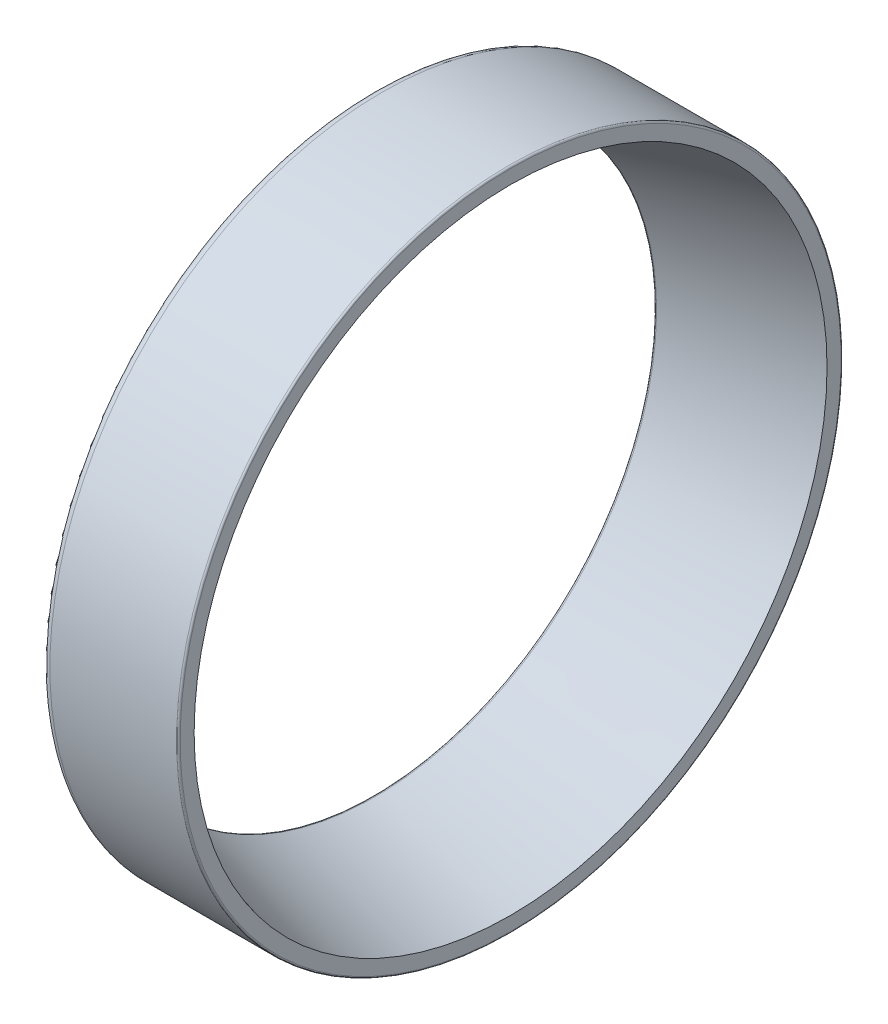
ISO-10303-21;
HEADER;
FILE_DESCRIPTION(('STEP AP214'),'2;1');
FILE_NAME('part.step','',(''),(''),'','','');
FILE_SCHEMA(('AUTOMOTIVE_DESIGN { 1 0 10303 214 1 1 1 1 }'));
ENDSEC;
DATA;
#1=APPLICATION_CONTEXT('core data for automotive mechanical design processes');
#2=APPLICATION_PROTOCOL_DEFINITION('international standard','automotive_design',2000,#1);
#3=PRODUCT_CONTEXT('',#1,'mechanical');
#4=PRODUCT('Part','Part','',(#3));
#5=PRODUCT_RELATED_PRODUCT_CATEGORY('part','',(#4));
#6=PRODUCT_DEFINITION_FORMATION('','',#4);
#7=PRODUCT_DEFINITION_CONTEXT('part definition',#1,'design');
#8=PRODUCT_DEFINITION('design','',#6,#7);
#9=PRODUCT_DEFINITION_SHAPE('','',#8);
#10=(LENGTH_UNIT() NAMED_UNIT(*) SI_UNIT(.MILLI.,.METRE.));
#11=(NAMED_UNIT(*) PLANE_ANGLE_UNIT() SI_UNIT($,.RADIAN.));
#12=(NAMED_UNIT(*) SI_UNIT($,.STERADIAN.) SOLID_ANGLE_UNIT());
#13=UNCERTAINTY_MEASURE_WITH_UNIT(LENGTH_MEASURE(1.E-05),#10,'distance_accuracy_value','');
#14=(GEOMETRIC_REPRESENTATION_CONTEXT(3) GLOBAL_UNCERTAINTY_ASSIGNED_CONTEXT((#13)) GLOBAL_UNIT_ASSIGNED_CONTEXT((#10,
#11,#12)) REPRESENTATION_CONTEXT('',''));
#15=CARTESIAN_POINT('',(0.,0.,0.));
#16=DIRECTION('',(0.,0.,1.));
#17=DIRECTION('',(1.,0.,0.));
#18=AXIS2_PLACEMENT_3D('',#15,#16,#17);
#19=CARTESIAN_POINT('',(0.2,0.,0.));
#20=DIRECTION('',(1.,0.,0.));
#21=DIRECTION('',(0.,0.,-1.));
#22=AXIS2_PLACEMENT_3D('',#19,#20,#21);
#23=TOROIDAL_SURFACE('',#22,31.9187738960017,0.2);
#24=CARTESIAN_POINT('',(0.250640159258825,0.,0.));
#25=DIRECTION('',(1.,0.,0.));
#26=DIRECTION('',(0.,1.,0.));
#27=AXIS2_PLACEMENT_3D('',#24,#25,#26);
#28=CIRCLE('',#27,31.7252911467183);
#29=CARTESIAN_POINT('',(0.250640159258825,31.7252911467183,0.));
#30=VERTEX_POINT('',#29);
#31=EDGE_CURVE('E11',#30,#30,#28,.T.);
#32=ORIENTED_EDGE('',*,*,#31,.T.);
#33=EDGE_LOOP('',(#32));
#34=FACE_BOUND('',#33,.T.);
#35=CARTESIAN_POINT('',(0.,0.,0.));
#36=DIRECTION('',(1.,0.,0.));
#37=DIRECTION('',(0.,1.,0.));
#38=AXIS2_PLACEMENT_3D('',#35,#36,#37);
#39=CIRCLE('',#38,31.9187738960017);
#40=CARTESIAN_POINT('',(0.,31.9187738960017,0.));
#41=VERTEX_POINT('',#40);
#42=EDGE_CURVE('E38',#41,#41,#39,.T.);
#43=ORIENTED_EDGE('',*,*,#42,.F.);
#44=EDGE_LOOP('',(#43));
#45=FACE_BOUND('',#44,.T.);
#46=ADVANCED_FACE('F16',(#34,#45),#23,.T.);
#47=CARTESIAN_POINT('',(7.87532007962941,0.,0.));
#48=DIRECTION('',(1.,0.,0.));
#49=DIRECTION('',(0.,1.,0.));
#50=AXIS2_PLACEMENT_3D('',#47,#48,#49);
#51=CONICAL_SURFACE('',#50,33.7208954416505,0.255987441390009);
#52=CARTESIAN_POINT('',(15.5,0.,0.));
#53=DIRECTION('',(1.,0.,0.));
#54=DIRECTION('',(0.,1.,0.));
#55=AXIS2_PLACEMENT_3D('',#52,#53,#54);
#56=CIRCLE('',#55,35.7164997365827);
#57=CARTESIAN_POINT('',(15.5,35.7164997365827,0.));
#58=VERTEX_POINT('',#57);
#59=EDGE_CURVE('E24',#58,#58,#56,.T.);
#60=ORIENTED_EDGE('',*,*,#59,.T.);
#61=EDGE_LOOP('',(#60));
#62=FACE_BOUND('',#61,.T.);
#63=ORIENTED_EDGE('',*,*,#31,.F.);
#64=EDGE_LOOP('',(#63));
#65=FACE_BOUND('',#64,.T.);
#66=ADVANCED_FACE('F81',(#62,#65),#51,.F.);
#67=CARTESIAN_POINT('',(15.5,36.5082498682914,0.));
#68=DIRECTION('',(1.,0.,0.));
#69=DIRECTION('',(0.,1.,0.));
#70=AXIS2_PLACEMENT_3D('',#67,#68,#69);
#71=PLANE('',#70);
#72=CARTESIAN_POINT('',(15.5,0.,0.));
#73=DIRECTION('',(1.,0.,0.));
#74=DIRECTION('',(0.,1.,0.));
#75=AXIS2_PLACEMENT_3D('',#72,#73,#74);
#76=CIRCLE('',#75,37.3);
#77=CARTESIAN_POINT('',(15.5,37.3,0.));
#78=VERTEX_POINT('',#77);
#79=EDGE_CURVE('E54',#78,#78,#76,.T.);
#80=ORIENTED_EDGE('',*,*,#79,.T.);
#81=EDGE_LOOP('',(#80));
#82=FACE_BOUND('',#81,.T.);
#83=ORIENTED_EDGE('',*,*,#59,.F.);
#84=EDGE_LOOP('',(#83));
#85=FACE_BOUND('',#84,.T.);
#86=ADVANCED_FACE('F55',(#82,#85),#71,.T.);
#87=CARTESIAN_POINT('',(15.3,0.,0.));
#88=DIRECTION('',(1.,0.,0.));
#89=DIRECTION('',(0.,0.,-1.));
#90=AXIS2_PLACEMENT_3D('',#87,#88,#89);
#91=TOROIDAL_SURFACE('',#90,37.3,0.2);
#92=CARTESIAN_POINT('',(15.3,0.,0.));
#93=DIRECTION('',(1.,0.,0.));
#94=DIRECTION('',(0.,1.,0.));
#95=AXIS2_PLACEMENT_3D('',#92,#93,#94);
#96=CIRCLE('',#95,37.5);
#97=CARTESIAN_POINT('',(15.3,37.5,0.));
#98=VERTEX_POINT('',#97);
#99=EDGE_CURVE('E50',#98,#98,#96,.T.);
#100=ORIENTED_EDGE('',*,*,#99,.T.);
#101=EDGE_LOOP('',(#100));
#102=FACE_BOUND('',#101,.T.);
#103=ORIENTED_EDGE('',*,*,#79,.F.);
#104=EDGE_LOOP('',(#103));
#105=FACE_BOUND('',#104,.T.);
#106=ADVANCED_FACE('F78',(#102,#105),#91,.T.);
#107=CARTESIAN_POINT('',(8.15,0.,0.));
#108=DIRECTION('',(-1.,0.,0.));
#109=DIRECTION('',(0.,1.,0.));
#110=AXIS2_PLACEMENT_3D('',#107,#108,#109);
#111=CYLINDRICAL_SURFACE('',#110,37.5);
#112=CARTESIAN_POINT('',(1.,0.,0.));
#113=DIRECTION('',(1.,0.,0.));
#114=DIRECTION('',(0.,1.,0.));
#115=AXIS2_PLACEMENT_3D('',#112,#113,#114);
#116=CIRCLE('',#115,37.5);
#117=CARTESIAN_POINT('',(1.,37.5,0.));
#118=VERTEX_POINT('',#117);
#119=EDGE_CURVE('E59',#118,#118,#116,.T.);
#120=ORIENTED_EDGE('',*,*,#119,.T.);
#121=EDGE_LOOP('',(#120));
#122=FACE_BOUND('',#121,.T.);
#123=ORIENTED_EDGE('',*,*,#99,.F.);
#124=EDGE_LOOP('',(#123));
#125=FACE_BOUND('',#124,.T.);
#126=ADVANCED_FACE('F66',(#122,#125),#111,.T.);
#127=CARTESIAN_POINT('',(1.,0.,0.));
#128=DIRECTION('',(1.,0.,0.));
#129=DIRECTION('',(0.,0.,-1.));
#130=AXIS2_PLACEMENT_3D('',#127,#128,#129);
#131=TOROIDAL_SURFACE('',#130,36.5,1.);
#132=CARTESIAN_POINT('',(0.,0.,0.));
#133=DIRECTION('',(1.,0.,0.));
#134=DIRECTION('',(0.,1.,0.));
#135=AXIS2_PLACEMENT_3D('',#132,#133,#134);
#136=CIRCLE('',#135,36.5);
#137=CARTESIAN_POINT('',(0.,36.5,0.));
#138=VERTEX_POINT('',#137);
#139=EDGE_CURVE('E46',#138,#138,#136,.T.);
#140=ORIENTED_EDGE('',*,*,#139,.T.);
#141=EDGE_LOOP('',(#140));
#142=FACE_BOUND('',#141,.T.);
#143=ORIENTED_EDGE('',*,*,#119,.F.);
#144=EDGE_LOOP('',(#143));
#145=FACE_BOUND('',#144,.T.);
#146=ADVANCED_FACE('F69',(#142,#145),#131,.T.);
#147=CARTESIAN_POINT('',(0.,34.2093869480009,0.));
#148=DIRECTION('',(-1.,0.,0.));
#149=DIRECTION('',(0.,-1.,0.));
#150=AXIS2_PLACEMENT_3D('',#147,#148,#149);
#151=PLANE('',#150);
#152=ORIENTED_EDGE('',*,*,#42,.T.);
#153=EDGE_LOOP('',(#152));
#154=FACE_BOUND('',#153,.T.);
#155=ORIENTED_EDGE('',*,*,#139,.F.);
#156=EDGE_LOOP('',(#155));
#157=FACE_BOUND('',#156,.T.);
#158=ADVANCED_FACE('F71',(#154,#157),#151,.T.);
#159=CLOSED_SHELL('',(#46,#66,#86,#106,#126,#146,#158));
#160=MANIFOLD_SOLID_BREP('B1',#159);
#161=ADVANCED_BREP_SHAPE_REPRESENTATION('',(#18,#160),#14);
#162=SHAPE_DEFINITION_REPRESENTATION(#9,#161);
ENDSEC;
END-ISO-10303-21;
